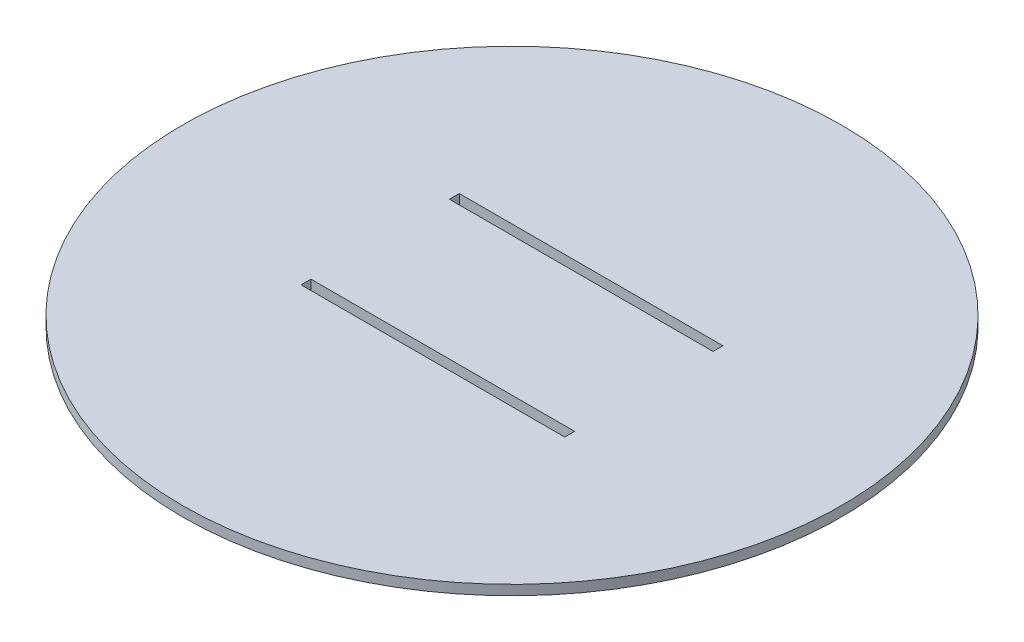
ISO-10303-21;
HEADER;
FILE_DESCRIPTION(('STEP AP214'),'2;1');
FILE_NAME('part.step','',(''),(''),'','','');
FILE_SCHEMA(('AUTOMOTIVE_DESIGN { 1 0 10303 214 1 1 1 1 }'));
ENDSEC;
DATA;
#1=APPLICATION_CONTEXT('core data for automotive mechanical design processes');
#2=APPLICATION_PROTOCOL_DEFINITION('international standard','automotive_design',2000,#1);
#3=PRODUCT_CONTEXT('',#1,'mechanical');
#4=PRODUCT('Part','Part','',(#3));
#5=PRODUCT_RELATED_PRODUCT_CATEGORY('part','',(#4));
#6=PRODUCT_DEFINITION_FORMATION('','',#4);
#7=PRODUCT_DEFINITION_CONTEXT('part definition',#1,'design');
#8=PRODUCT_DEFINITION('design','',#6,#7);
#9=PRODUCT_DEFINITION_SHAPE('','',#8);
#10=(LENGTH_UNIT() NAMED_UNIT(*) SI_UNIT(.MILLI.,.METRE.));
#11=(NAMED_UNIT(*) PLANE_ANGLE_UNIT() SI_UNIT($,.RADIAN.));
#12=(NAMED_UNIT(*) SI_UNIT($,.STERADIAN.) SOLID_ANGLE_UNIT());
#13=UNCERTAINTY_MEASURE_WITH_UNIT(LENGTH_MEASURE(1.E-05),#10,'distance_accuracy_value','');
#14=(GEOMETRIC_REPRESENTATION_CONTEXT(3) GLOBAL_UNCERTAINTY_ASSIGNED_CONTEXT((#13)) GLOBAL_UNIT_ASSIGNED_CONTEXT((#10,
#11,#12)) REPRESENTATION_CONTEXT('',''));
#15=CARTESIAN_POINT('',(0.,0.,0.));
#16=DIRECTION('',(0.,0.,1.));
#17=DIRECTION('',(1.,0.,0.));
#18=AXIS2_PLACEMENT_3D('',#15,#16,#17);
#19=CARTESIAN_POINT('',(0.,3.,0.));
#20=DIRECTION('',(0.,1.,0.));
#21=DIRECTION('',(0.,0.,1.));
#22=AXIS2_PLACEMENT_3D('',#19,#20,#21);
#23=PLANE('',#22);
#24=DIRECTION('',(1.,0.,0.));
#25=VECTOR('',#24,1.);
#26=CARTESIAN_POINT('',(-40.,3.,24.));
#27=LINE('',#26,#25);
#28=CARTESIAN_POINT('',(-40.,3.,24.));
#29=VERTEX_POINT('',#28);
#30=CARTESIAN_POINT('',(40.,3.,24.));
#31=VERTEX_POINT('',#30);
#32=EDGE_CURVE('E136',#29,#31,#27,.T.);
#33=ORIENTED_EDGE('',*,*,#32,.F.);
#34=DIRECTION('',(0.,0.,1.));
#35=VECTOR('',#34,1.);
#36=CARTESIAN_POINT('',(-40.,3.,21.));
#37=LINE('',#36,#35);
#38=CARTESIAN_POINT('',(-40.,3.,21.));
#39=VERTEX_POINT('',#38);
#40=EDGE_CURVE('E134',#39,#29,#37,.T.);
#41=ORIENTED_EDGE('',*,*,#40,.F.);
#42=DIRECTION('',(-1.,0.,0.));
#43=VECTOR('',#42,1.);
#44=CARTESIAN_POINT('',(-40.,3.,21.));
#45=LINE('',#44,#43);
#46=CARTESIAN_POINT('',(40.,3.,21.));
#47=VERTEX_POINT('',#46);
#48=EDGE_CURVE('E142',#47,#39,#45,.T.);
#49=ORIENTED_EDGE('',*,*,#48,.F.);
#50=DIRECTION('',(0.,0.,-1.));
#51=VECTOR('',#50,1.);
#52=CARTESIAN_POINT('',(40.,3.,21.));
#53=LINE('',#52,#51);
#54=EDGE_CURVE('E139',#31,#47,#53,.T.);
#55=ORIENTED_EDGE('',*,*,#54,.F.);
#56=EDGE_LOOP('',(#33,#41,#49,#55));
#57=FACE_BOUND('',#56,.T.);
#58=CARTESIAN_POINT('',(0.,3.,0.));
#59=DIRECTION('',(0.,1.,0.));
#60=DIRECTION('',(0.,0.,1.));
#61=AXIS2_PLACEMENT_3D('',#58,#59,#60);
#62=CIRCLE('',#61,100.);
#63=CARTESIAN_POINT('',(0.,3.,100.));
#64=VERTEX_POINT('',#63);
#65=EDGE_CURVE('E11',#64,#64,#62,.T.);
#66=ORIENTED_EDGE('',*,*,#65,.T.);
#67=EDGE_LOOP('',(#66));
#68=FACE_BOUND('',#67,.T.);
#69=DIRECTION('',(1.,0.,0.));
#70=VECTOR('',#69,1.);
#71=CARTESIAN_POINT('',(-40.,3.,-21.));
#72=LINE('',#71,#70);
#73=CARTESIAN_POINT('',(-40.,3.,-21.));
#74=VERTEX_POINT('',#73);
#75=CARTESIAN_POINT('',(40.,3.,-21.));
#76=VERTEX_POINT('',#75);
#77=EDGE_CURVE('E106',#74,#76,#72,.T.);
#78=ORIENTED_EDGE('',*,*,#77,.F.);
#79=DIRECTION('',(0.,0.,1.));
#80=VECTOR('',#79,1.);
#81=CARTESIAN_POINT('',(-40.,3.,-24.));
#82=LINE('',#81,#80);
#83=CARTESIAN_POINT('',(-40.,3.,-24.));
#84=VERTEX_POINT('',#83);
#85=EDGE_CURVE('E98',#84,#74,#82,.T.);
#86=ORIENTED_EDGE('',*,*,#85,.F.);
#87=DIRECTION('',(-1.,0.,0.));
#88=VECTOR('',#87,1.);
#89=CARTESIAN_POINT('',(-40.,3.,-24.));
#90=LINE('',#89,#88);
#91=CARTESIAN_POINT('',(40.,3.,-24.));
#92=VERTEX_POINT('',#91);
#93=EDGE_CURVE('E120',#92,#84,#90,.T.);
#94=ORIENTED_EDGE('',*,*,#93,.F.);
#95=DIRECTION('',(0.,0.,-1.));
#96=VECTOR('',#95,1.);
#97=CARTESIAN_POINT('',(40.,3.,-24.));
#98=LINE('',#97,#96);
#99=EDGE_CURVE('E118',#76,#92,#98,.T.);
#100=ORIENTED_EDGE('',*,*,#99,.F.);
#101=EDGE_LOOP('',(#78,#86,#94,#100));
#102=FACE_BOUND('',#101,.T.);
#103=ADVANCED_FACE('F33',(#57,#68,#102),#23,.T.);
#104=CARTESIAN_POINT('',(0.,0.,0.));
#105=DIRECTION('',(0.,1.,0.));
#106=DIRECTION('',(0.,0.,1.));
#107=AXIS2_PLACEMENT_3D('',#104,#105,#106);
#108=PLANE('',#107);
#109=DIRECTION('',(0.,0.,1.));
#110=VECTOR('',#109,1.);
#111=CARTESIAN_POINT('',(-40.,0.,21.));
#112=LINE('',#111,#110);
#113=CARTESIAN_POINT('',(-40.,0.,21.));
#114=VERTEX_POINT('',#113);
#115=CARTESIAN_POINT('',(-40.,0.,24.));
#116=VERTEX_POINT('',#115);
#117=EDGE_CURVE('E114',#114,#116,#112,.T.);
#118=ORIENTED_EDGE('',*,*,#117,.T.);
#119=DIRECTION('',(1.,0.,0.));
#120=VECTOR('',#119,1.);
#121=CARTESIAN_POINT('',(-40.,0.,24.));
#122=LINE('',#121,#120);
#123=CARTESIAN_POINT('',(40.,0.,24.));
#124=VERTEX_POINT('',#123);
#125=EDGE_CURVE('E147',#116,#124,#122,.T.);
#126=ORIENTED_EDGE('',*,*,#125,.T.);
#127=DIRECTION('',(0.,0.,-1.));
#128=VECTOR('',#127,1.);
#129=CARTESIAN_POINT('',(40.,0.,21.));
#130=LINE('',#129,#128);
#131=CARTESIAN_POINT('',(40.,0.,21.));
#132=VERTEX_POINT('',#131);
#133=EDGE_CURVE('E150',#124,#132,#130,.T.);
#134=ORIENTED_EDGE('',*,*,#133,.T.);
#135=DIRECTION('',(-1.,0.,0.));
#136=VECTOR('',#135,1.);
#137=CARTESIAN_POINT('',(-40.,0.,21.));
#138=LINE('',#137,#136);
#139=EDGE_CURVE('E137',#132,#114,#138,.T.);
#140=ORIENTED_EDGE('',*,*,#139,.T.);
#141=EDGE_LOOP('',(#118,#126,#134,#140));
#142=FACE_BOUND('',#141,.T.);
#143=CARTESIAN_POINT('',(0.,0.,0.));
#144=DIRECTION('',(0.,1.,0.));
#145=DIRECTION('',(0.,0.,1.));
#146=AXIS2_PLACEMENT_3D('',#143,#144,#145);
#147=CIRCLE('',#146,100.);
#148=CARTESIAN_POINT('',(0.,0.,100.));
#149=VERTEX_POINT('',#148);
#150=EDGE_CURVE('E37',#149,#149,#147,.T.);
#151=ORIENTED_EDGE('',*,*,#150,.F.);
#152=EDGE_LOOP('',(#151));
#153=FACE_BOUND('',#152,.T.);
#154=DIRECTION('',(0.,0.,1.));
#155=VECTOR('',#154,1.);
#156=CARTESIAN_POINT('',(-40.,0.,-24.));
#157=LINE('',#156,#155);
#158=CARTESIAN_POINT('',(-40.,0.,-24.));
#159=VERTEX_POINT('',#158);
#160=CARTESIAN_POINT('',(-40.,0.,-21.));
#161=VERTEX_POINT('',#160);
#162=EDGE_CURVE('E56',#159,#161,#157,.T.);
#163=ORIENTED_EDGE('',*,*,#162,.T.);
#164=DIRECTION('',(1.,0.,0.));
#165=VECTOR('',#164,1.);
#166=CARTESIAN_POINT('',(-40.,0.,-21.));
#167=LINE('',#166,#165);
#168=CARTESIAN_POINT('',(40.,0.,-21.));
#169=VERTEX_POINT('',#168);
#170=EDGE_CURVE('E113',#161,#169,#167,.T.);
#171=ORIENTED_EDGE('',*,*,#170,.T.);
#172=DIRECTION('',(0.,0.,-1.));
#173=VECTOR('',#172,1.);
#174=CARTESIAN_POINT('',(40.,0.,-24.));
#175=LINE('',#174,#173);
#176=CARTESIAN_POINT('',(40.,0.,-24.));
#177=VERTEX_POINT('',#176);
#178=EDGE_CURVE('E126',#169,#177,#175,.T.);
#179=ORIENTED_EDGE('',*,*,#178,.T.);
#180=DIRECTION('',(-1.,0.,0.));
#181=VECTOR('',#180,1.);
#182=CARTESIAN_POINT('',(-40.,0.,-24.));
#183=LINE('',#182,#181);
#184=EDGE_CURVE('E107',#177,#159,#183,.T.);
#185=ORIENTED_EDGE('',*,*,#184,.T.);
#186=EDGE_LOOP('',(#163,#171,#179,#185));
#187=FACE_BOUND('',#186,.T.);
#188=ADVANCED_FACE('F169',(#142,#153,#187),#108,.F.);
#189=CARTESIAN_POINT('',(0.,3.,0.));
#190=DIRECTION('',(0.,-1.,0.));
#191=DIRECTION('',(0.,0.,-1.));
#192=AXIS2_PLACEMENT_3D('',#189,#190,#191);
#193=CYLINDRICAL_SURFACE('',#192,100.);
#194=ORIENTED_EDGE('',*,*,#65,.F.);
#195=EDGE_LOOP('',(#194));
#196=FACE_BOUND('',#195,.T.);
#197=ORIENTED_EDGE('',*,*,#150,.T.);
#198=EDGE_LOOP('',(#197));
#199=FACE_BOUND('',#198,.T.);
#200=ADVANCED_FACE('F35',(#196,#199),#193,.T.);
#201=CARTESIAN_POINT('',(-40.,3.,21.));
#202=DIRECTION('',(1.,0.,0.));
#203=DIRECTION('',(0.,0.,-1.));
#204=AXIS2_PLACEMENT_3D('',#201,#202,#203);
#205=PLANE('',#204);
#206=ORIENTED_EDGE('',*,*,#117,.F.);
#207=DIRECTION('',(0.,-1.,0.));
#208=VECTOR('',#207,1.);
#209=CARTESIAN_POINT('',(-40.,3.,21.));
#210=LINE('',#209,#208);
#211=EDGE_CURVE('E144',#39,#114,#210,.T.);
#212=ORIENTED_EDGE('',*,*,#211,.F.);
#213=ORIENTED_EDGE('',*,*,#40,.T.);
#214=DIRECTION('',(0.,-1.,0.));
#215=VECTOR('',#214,1.);
#216=CARTESIAN_POINT('',(-40.,3.,24.));
#217=LINE('',#216,#215);
#218=EDGE_CURVE('E161',#29,#116,#217,.T.);
#219=ORIENTED_EDGE('',*,*,#218,.T.);
#220=EDGE_LOOP('',(#206,#212,#213,#219));
#221=FACE_BOUND('',#220,.T.);
#222=ADVANCED_FACE('F191',(#221),#205,.T.);
#223=CARTESIAN_POINT('',(-40.,3.,24.));
#224=DIRECTION('',(0.,0.,-1.));
#225=DIRECTION('',(-1.,0.,0.));
#226=AXIS2_PLACEMENT_3D('',#223,#224,#225);
#227=PLANE('',#226);
#228=ORIENTED_EDGE('',*,*,#125,.F.);
#229=ORIENTED_EDGE('',*,*,#218,.F.);
#230=ORIENTED_EDGE('',*,*,#32,.T.);
#231=DIRECTION('',(0.,-1.,0.));
#232=VECTOR('',#231,1.);
#233=CARTESIAN_POINT('',(40.,3.,24.));
#234=LINE('',#233,#232);
#235=EDGE_CURVE('E159',#31,#124,#234,.T.);
#236=ORIENTED_EDGE('',*,*,#235,.T.);
#237=EDGE_LOOP('',(#228,#229,#230,#236));
#238=FACE_BOUND('',#237,.T.);
#239=ADVANCED_FACE('F194',(#238),#227,.T.);
#240=CARTESIAN_POINT('',(40.,3.,21.));
#241=DIRECTION('',(-1.,0.,0.));
#242=DIRECTION('',(0.,0.,1.));
#243=AXIS2_PLACEMENT_3D('',#240,#241,#242);
#244=PLANE('',#243);
#245=ORIENTED_EDGE('',*,*,#133,.F.);
#246=ORIENTED_EDGE('',*,*,#235,.F.);
#247=ORIENTED_EDGE('',*,*,#54,.T.);
#248=DIRECTION('',(0.,-1.,0.));
#249=VECTOR('',#248,1.);
#250=CARTESIAN_POINT('',(40.,3.,21.));
#251=LINE('',#250,#249);
#252=EDGE_CURVE('E157',#47,#132,#251,.T.);
#253=ORIENTED_EDGE('',*,*,#252,.T.);
#254=EDGE_LOOP('',(#245,#246,#247,#253));
#255=FACE_BOUND('',#254,.T.);
#256=ADVANCED_FACE('F197',(#255),#244,.T.);
#257=CARTESIAN_POINT('',(-40.,3.,21.));
#258=DIRECTION('',(0.,0.,1.));
#259=DIRECTION('',(1.,0.,0.));
#260=AXIS2_PLACEMENT_3D('',#257,#258,#259);
#261=PLANE('',#260);
#262=ORIENTED_EDGE('',*,*,#139,.F.);
#263=ORIENTED_EDGE('',*,*,#252,.F.);
#264=ORIENTED_EDGE('',*,*,#48,.T.);
#265=ORIENTED_EDGE('',*,*,#211,.T.);
#266=EDGE_LOOP('',(#262,#263,#264,#265));
#267=FACE_BOUND('',#266,.T.);
#268=ADVANCED_FACE('F201',(#267),#261,.T.);
#269=CARTESIAN_POINT('',(-40.,3.,-24.));
#270=DIRECTION('',(1.,0.,0.));
#271=DIRECTION('',(0.,0.,-1.));
#272=AXIS2_PLACEMENT_3D('',#269,#270,#271);
#273=PLANE('',#272);
#274=ORIENTED_EDGE('',*,*,#162,.F.);
#275=DIRECTION('',(0.,-1.,0.));
#276=VECTOR('',#275,1.);
#277=CARTESIAN_POINT('',(-40.,3.,-24.));
#278=LINE('',#277,#276);
#279=EDGE_CURVE('E102',#84,#159,#278,.T.);
#280=ORIENTED_EDGE('',*,*,#279,.F.);
#281=ORIENTED_EDGE('',*,*,#85,.T.);
#282=DIRECTION('',(0.,-1.,0.));
#283=VECTOR('',#282,1.);
#284=CARTESIAN_POINT('',(-40.,3.,-21.));
#285=LINE('',#284,#283);
#286=EDGE_CURVE('E101',#74,#161,#285,.T.);
#287=ORIENTED_EDGE('',*,*,#286,.T.);
#288=EDGE_LOOP('',(#274,#280,#281,#287));
#289=FACE_BOUND('',#288,.T.);
#290=ADVANCED_FACE('F100',(#289),#273,.T.);
#291=CARTESIAN_POINT('',(-40.,3.,-21.));
#292=DIRECTION('',(0.,0.,-1.));
#293=DIRECTION('',(-1.,0.,0.));
#294=AXIS2_PLACEMENT_3D('',#291,#292,#293);
#295=PLANE('',#294);
#296=ORIENTED_EDGE('',*,*,#170,.F.);
#297=ORIENTED_EDGE('',*,*,#286,.F.);
#298=ORIENTED_EDGE('',*,*,#77,.T.);
#299=DIRECTION('',(0.,-1.,0.));
#300=VECTOR('',#299,1.);
#301=CARTESIAN_POINT('',(40.,3.,-21.));
#302=LINE('',#301,#300);
#303=EDGE_CURVE('E115',#76,#169,#302,.T.);
#304=ORIENTED_EDGE('',*,*,#303,.T.);
#305=EDGE_LOOP('',(#296,#297,#298,#304));
#306=FACE_BOUND('',#305,.T.);
#307=ADVANCED_FACE('F110',(#306),#295,.T.);
#308=CARTESIAN_POINT('',(40.,3.,-24.));
#309=DIRECTION('',(-1.,0.,0.));
#310=DIRECTION('',(0.,0.,1.));
#311=AXIS2_PLACEMENT_3D('',#308,#309,#310);
#312=PLANE('',#311);
#313=ORIENTED_EDGE('',*,*,#178,.F.);
#314=ORIENTED_EDGE('',*,*,#303,.F.);
#315=ORIENTED_EDGE('',*,*,#99,.T.);
#316=DIRECTION('',(0.,-1.,0.));
#317=VECTOR('',#316,1.);
#318=CARTESIAN_POINT('',(40.,3.,-24.));
#319=LINE('',#318,#317);
#320=EDGE_CURVE('E48',#92,#177,#319,.T.);
#321=ORIENTED_EDGE('',*,*,#320,.T.);
#322=EDGE_LOOP('',(#313,#314,#315,#321));
#323=FACE_BOUND('',#322,.T.);
#324=ADVANCED_FACE('F176',(#323),#312,.T.);
#325=CARTESIAN_POINT('',(-40.,3.,-24.));
#326=DIRECTION('',(0.,0.,1.));
#327=DIRECTION('',(1.,0.,0.));
#328=AXIS2_PLACEMENT_3D('',#325,#326,#327);
#329=PLANE('',#328);
#330=ORIENTED_EDGE('',*,*,#184,.F.);
#331=ORIENTED_EDGE('',*,*,#320,.F.);
#332=ORIENTED_EDGE('',*,*,#93,.T.);
#333=ORIENTED_EDGE('',*,*,#279,.T.);
#334=EDGE_LOOP('',(#330,#331,#332,#333));
#335=FACE_BOUND('',#334,.T.);
#336=ADVANCED_FACE('F174',(#335),#329,.T.);
#337=CLOSED_SHELL('',(#103,#188,#200,#222,#239,#256,#268,#290,#307,#324,#336));
#338=MANIFOLD_SOLID_BREP('B2',#337);
#339=ADVANCED_BREP_SHAPE_REPRESENTATION('',(#18,#338),#14);
#340=SHAPE_DEFINITION_REPRESENTATION(#9,#339);
ENDSEC;
END-ISO-10303-21;
